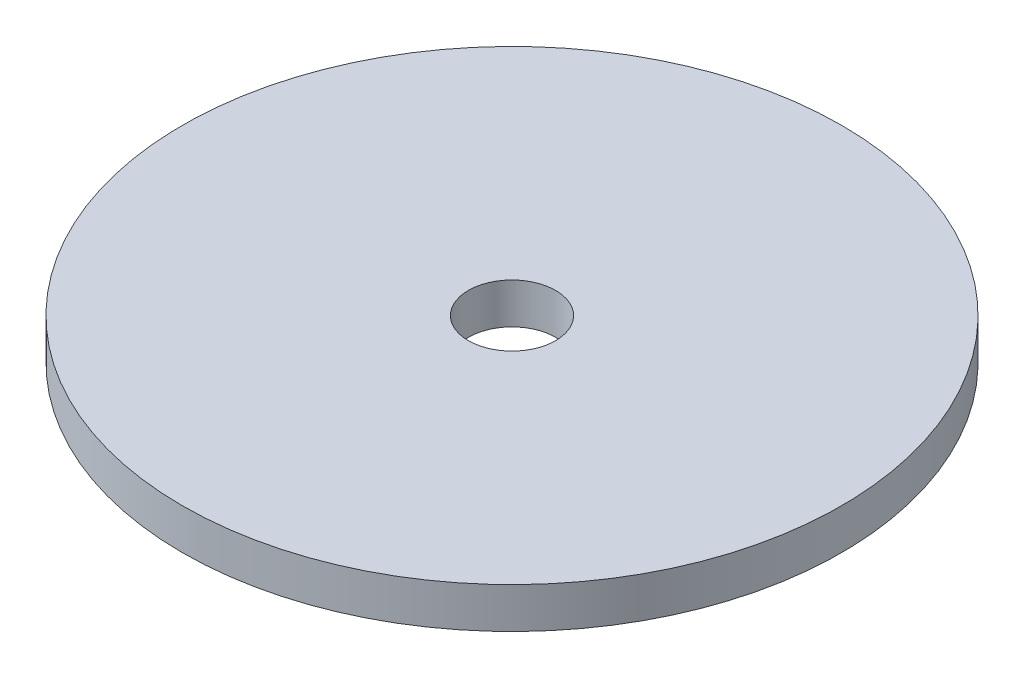
ISO-10303-21;
HEADER;
FILE_DESCRIPTION(('STEP AP214'),'2;1');
FILE_NAME('part.step','',(''),(''),'','','');
FILE_SCHEMA(('AUTOMOTIVE_DESIGN { 1 0 10303 214 1 1 1 1 }'));
ENDSEC;
DATA;
#1=APPLICATION_CONTEXT('core data for automotive mechanical design processes');
#2=APPLICATION_PROTOCOL_DEFINITION('international standard','automotive_design',2000,#1);
#3=PRODUCT_CONTEXT('',#1,'mechanical');
#4=PRODUCT('Part','Part','',(#3));
#5=PRODUCT_RELATED_PRODUCT_CATEGORY('part','',(#4));
#6=PRODUCT_DEFINITION_FORMATION('','',#4);
#7=PRODUCT_DEFINITION_CONTEXT('part definition',#1,'design');
#8=PRODUCT_DEFINITION('design','',#6,#7);
#9=PRODUCT_DEFINITION_SHAPE('','',#8);
#10=(LENGTH_UNIT() NAMED_UNIT(*) SI_UNIT(.MILLI.,.METRE.));
#11=(NAMED_UNIT(*) PLANE_ANGLE_UNIT() SI_UNIT($,.RADIAN.));
#12=(NAMED_UNIT(*) SI_UNIT($,.STERADIAN.) SOLID_ANGLE_UNIT());
#13=UNCERTAINTY_MEASURE_WITH_UNIT(LENGTH_MEASURE(1.E-05),#10,'distance_accuracy_value','');
#14=(GEOMETRIC_REPRESENTATION_CONTEXT(3) GLOBAL_UNCERTAINTY_ASSIGNED_CONTEXT((#13)) GLOBAL_UNIT_ASSIGNED_CONTEXT((#10,
#11,#12)) REPRESENTATION_CONTEXT('',''));
#15=CARTESIAN_POINT('',(0.,0.,0.));
#16=DIRECTION('',(0.,0.,1.));
#17=DIRECTION('',(1.,0.,0.));
#18=AXIS2_PLACEMENT_3D('',#15,#16,#17);
#19=CARTESIAN_POINT('',(0.,1.190625,0.));
#20=DIRECTION('',(0.,-1.,0.));
#21=DIRECTION('',(0.,0.,-1.));
#22=AXIS2_PLACEMENT_3D('',#19,#20,#21);
#23=CYLINDRICAL_SURFACE('',#22,19.304);
#24=CARTESIAN_POINT('',(0.,1.190625,0.));
#25=DIRECTION('',(0.,1.,0.));
#26=DIRECTION('',(0.,0.,1.));
#27=AXIS2_PLACEMENT_3D('',#24,#25,#26);
#28=CIRCLE('',#27,19.304);
#29=CARTESIAN_POINT('',(0.,1.190625,-19.304));
#30=VERTEX_POINT('',#29);
#31=EDGE_CURVE('E10',#30,#30,#28,.T.);
#32=CARTESIAN_POINT('',(0.,-1.190625,0.));
#33=DIRECTION('',(0.,1.,0.));
#34=DIRECTION('',(0.,0.,1.));
#35=AXIS2_PLACEMENT_3D('',#32,#33,#34);
#36=CIRCLE('',#35,19.304);
#37=CARTESIAN_POINT('',(0.,-1.190625,-19.304));
#38=VERTEX_POINT('',#37);
#39=EDGE_CURVE('E40',#38,#38,#36,.T.);
#40=CARTESIAN_POINT('',(0.,1.190625,-19.304));
#41=CARTESIAN_POINT('',(0.,1.1658203125,-19.304));
#42=CARTESIAN_POINT('',(0.,1.141015625,-19.304));
#43=CARTESIAN_POINT('',(0.,1.09140625,-19.304));
#44=CARTESIAN_POINT('',(0.,1.0666015625,-19.304));
#45=CARTESIAN_POINT('',(0.,1.0169921875,-19.304));
#46=CARTESIAN_POINT('',(0.,0.9921875,-19.304));
#47=CARTESIAN_POINT('',(0.,0.942578125,-19.304));
#48=CARTESIAN_POINT('',(0.,0.9177734375,-19.304));
#49=CARTESIAN_POINT('',(0.,0.8681640625,-19.304));
#50=CARTESIAN_POINT('',(0.,0.843359375,-19.304));
#51=CARTESIAN_POINT('',(0.,0.79375,-19.304));
#52=CARTESIAN_POINT('',(0.,0.7689453125,-19.304));
#53=CARTESIAN_POINT('',(0.,0.7193359375,-19.304));
#54=CARTESIAN_POINT('',(0.,0.69453125,-19.304));
#55=CARTESIAN_POINT('',(0.,0.644921875,-19.304));
#56=CARTESIAN_POINT('',(0.,0.6201171875,-19.304));
#57=CARTESIAN_POINT('',(0.,0.5705078125,-19.304));
#58=CARTESIAN_POINT('',(0.,0.545703125,-19.304));
#59=CARTESIAN_POINT('',(0.,0.49609375,-19.304));
#60=CARTESIAN_POINT('',(0.,0.4712890625,-19.304));
#61=CARTESIAN_POINT('',(0.,0.4216796875,-19.304));
#62=CARTESIAN_POINT('',(0.,0.396875,-19.304));
#63=CARTESIAN_POINT('',(0.,0.347265625,-19.304));
#64=CARTESIAN_POINT('',(0.,0.3224609375,-19.304));
#65=CARTESIAN_POINT('',(0.,0.2728515625,-19.304));
#66=CARTESIAN_POINT('',(0.,0.248046875,-19.304));
#67=CARTESIAN_POINT('',(0.,0.1984375,-19.304));
#68=CARTESIAN_POINT('',(0.,0.1736328125,-19.304));
#69=CARTESIAN_POINT('',(0.,0.1240234375,-19.304));
#70=CARTESIAN_POINT('',(0.,0.0992187499999998,-19.304));
#71=CARTESIAN_POINT('',(0.,0.0496093749999998,-19.304));
#72=CARTESIAN_POINT('',(0.,0.0248046874999998,-19.304));
#73=CARTESIAN_POINT('',(0.,-0.0248046875000002,-19.304));
#74=CARTESIAN_POINT('',(0.,-0.0496093750000002,-19.304));
#75=CARTESIAN_POINT('',(0.,-0.0992187500000003,-19.304));
#76=CARTESIAN_POINT('',(0.,-0.1240234375,-19.304));
#77=CARTESIAN_POINT('',(0.,-0.1736328125,-19.304));
#78=CARTESIAN_POINT('',(0.,-0.1984375,-19.304));
#79=CARTESIAN_POINT('',(0.,-0.248046875,-19.304));
#80=CARTESIAN_POINT('',(0.,-0.2728515625,-19.304));
#81=CARTESIAN_POINT('',(0.,-0.3224609375,-19.304));
#82=CARTESIAN_POINT('',(0.,-0.347265625,-19.304));
#83=CARTESIAN_POINT('',(0.,-0.396875,-19.304));
#84=CARTESIAN_POINT('',(0.,-0.4216796875,-19.304));
#85=CARTESIAN_POINT('',(0.,-0.4712890625,-19.304));
#86=CARTESIAN_POINT('',(0.,-0.49609375,-19.304));
#87=CARTESIAN_POINT('',(0.,-0.545703125,-19.304));
#88=CARTESIAN_POINT('',(0.,-0.5705078125,-19.304));
#89=CARTESIAN_POINT('',(0.,-0.6201171875,-19.304));
#90=CARTESIAN_POINT('',(0.,-0.644921875,-19.304));
#91=CARTESIAN_POINT('',(0.,-0.69453125,-19.304));
#92=CARTESIAN_POINT('',(0.,-0.7193359375,-19.304));
#93=CARTESIAN_POINT('',(0.,-0.7689453125,-19.304));
#94=CARTESIAN_POINT('',(0.,-0.79375,-19.304));
#95=CARTESIAN_POINT('',(0.,-0.843359375,-19.304));
#96=CARTESIAN_POINT('',(0.,-0.8681640625,-19.304));
#97=CARTESIAN_POINT('',(0.,-0.9177734375,-19.304));
#98=CARTESIAN_POINT('',(0.,-0.942578125,-19.304));
#99=CARTESIAN_POINT('',(0.,-0.9921875,-19.304));
#100=CARTESIAN_POINT('',(0.,-1.0169921875,-19.304));
#101=CARTESIAN_POINT('',(0.,-1.0666015625,-19.304));
#102=CARTESIAN_POINT('',(0.,-1.09140625,-19.304));
#103=CARTESIAN_POINT('',(0.,-1.141015625,-19.304));
#104=CARTESIAN_POINT('',(0.,-1.1658203125,-19.304));
#105=CARTESIAN_POINT('',(0.,-1.190625,-19.304));
#106=B_SPLINE_CURVE_WITH_KNOTS('',3,(#40,#41,#42,#43,#44,#45,#46,#47,#48,#49,#50,#51,#52,#53,
#54,#55,#56,#57,#58,#59,#60,#61,#62,#63,#64,#65,#66,#67,#68,#69,#70,#71,#72,#73,#74,#75,#76,#77,
#78,#79,#80,#81,#82,#83,#84,#85,#86,#87,#88,#89,#90,#91,#92,#93,#94,#95,#96,#97,#98,#99,#100,
#101,#102,#103,#104,#105),.UNSPECIFIED.,.F.,.F.,(4,2,2,2,2,2,2,2,2,2,2,2,2,2,2,2,2,2,2,2,2,2,2,
2,2,2,2,2,2,2,2,2,4),(0.,0.0744140624999998,0.148828125,0.2232421875,0.29765625,0.3720703125,
0.446484375,0.5208984375,0.5953125,0.6697265625,0.744140625,0.8185546875,0.89296875,
0.9673828125,1.041796875,1.1162109375,1.190625,1.2650390625,1.339453125,1.4138671875,1.48828125,
1.5626953125,1.637109375,1.7115234375,1.7859375,1.8603515625,1.934765625,2.0091796875,
2.08359375,2.1580078125,2.232421875,2.3068359375,2.38125),.UNSPECIFIED.);
#107=EDGE_CURVE('BSEAM37',#30,#38,#106,.T.);
#108=ORIENTED_EDGE('',*,*,#31,.F.);
#109=ORIENTED_EDGE('',*,*,#39,.T.);
#110=ORIENTED_EDGE('',*,*,#107,.T.);
#111=ORIENTED_EDGE('',*,*,#107,.F.);
#112=EDGE_LOOP('',(#108,#110,#109,#111));
#113=FACE_BOUND('',#112,.T.);
#114=ADVANCED_FACE('F37',(#113),#23,.T.);
#115=CARTESIAN_POINT('',(0.,1.190625,0.));
#116=DIRECTION('',(0.,1.,0.));
#117=DIRECTION('',(0.,0.,1.));
#118=AXIS2_PLACEMENT_3D('',#115,#116,#117);
#119=PLANE('',#118);
#120=CARTESIAN_POINT('',(0.,1.190625,0.));
#121=DIRECTION('',(0.,1.,0.));
#122=DIRECTION('',(0.,0.,1.));
#123=AXIS2_PLACEMENT_3D('',#120,#121,#122);
#124=CIRCLE('',#123,2.5527);
#125=CARTESIAN_POINT('',(0.,1.190625,2.5527));
#126=VERTEX_POINT('',#125);
#127=EDGE_CURVE('E54',#126,#126,#124,.T.);
#128=ORIENTED_EDGE('',*,*,#127,.F.);
#129=EDGE_LOOP('',(#128));
#130=FACE_BOUND('',#129,.T.);
#131=ORIENTED_EDGE('',*,*,#31,.T.);
#132=EDGE_LOOP('',(#131));
#133=FACE_BOUND('',#132,.T.);
#134=ADVANCED_FACE('F61',(#130,#133),#119,.T.);
#135=CARTESIAN_POINT('',(0.,-1.190625,0.));
#136=DIRECTION('',(0.,1.,0.));
#137=DIRECTION('',(0.,0.,1.));
#138=AXIS2_PLACEMENT_3D('',#135,#136,#137);
#139=PLANE('',#138);
#140=CARTESIAN_POINT('',(0.,-1.190625,0.));
#141=DIRECTION('',(0.,1.,0.));
#142=DIRECTION('',(0.,0.,1.));
#143=AXIS2_PLACEMENT_3D('',#140,#141,#142);
#144=CIRCLE('',#143,2.5527);
#145=CARTESIAN_POINT('',(0.,-1.190625,2.5527));
#146=VERTEX_POINT('',#145);
#147=EDGE_CURVE('E49',#146,#146,#144,.T.);
#148=ORIENTED_EDGE('',*,*,#147,.T.);
#149=EDGE_LOOP('',(#148));
#150=FACE_BOUND('',#149,.T.);
#151=ORIENTED_EDGE('',*,*,#39,.F.);
#152=EDGE_LOOP('',(#151));
#153=FACE_BOUND('',#152,.T.);
#154=ADVANCED_FACE('F63',(#150,#153),#139,.F.);
#155=CARTESIAN_POINT('',(0.,1.190625,0.));
#156=DIRECTION('',(0.,1.,0.));
#157=DIRECTION('',(0.,0.,1.));
#158=AXIS2_PLACEMENT_3D('',#155,#156,#157);
#159=CYLINDRICAL_SURFACE('',#158,2.5527);
#160=ORIENTED_EDGE('',*,*,#147,.F.);
#161=EDGE_LOOP('',(#160));
#162=FACE_BOUND('',#161,.T.);
#163=ORIENTED_EDGE('',*,*,#127,.T.);
#164=EDGE_LOOP('',(#163));
#165=FACE_BOUND('',#164,.T.);
#166=ADVANCED_FACE('F59',(#162,#165),#159,.F.);
#167=CLOSED_SHELL('',(#114,#134,#154,#166));
#168=MANIFOLD_SOLID_BREP('B2',#167);
#169=ADVANCED_BREP_SHAPE_REPRESENTATION('',(#18,#168),#14);
#170=SHAPE_DEFINITION_REPRESENTATION(#9,#169);
ENDSEC;
END-ISO-10303-21;
